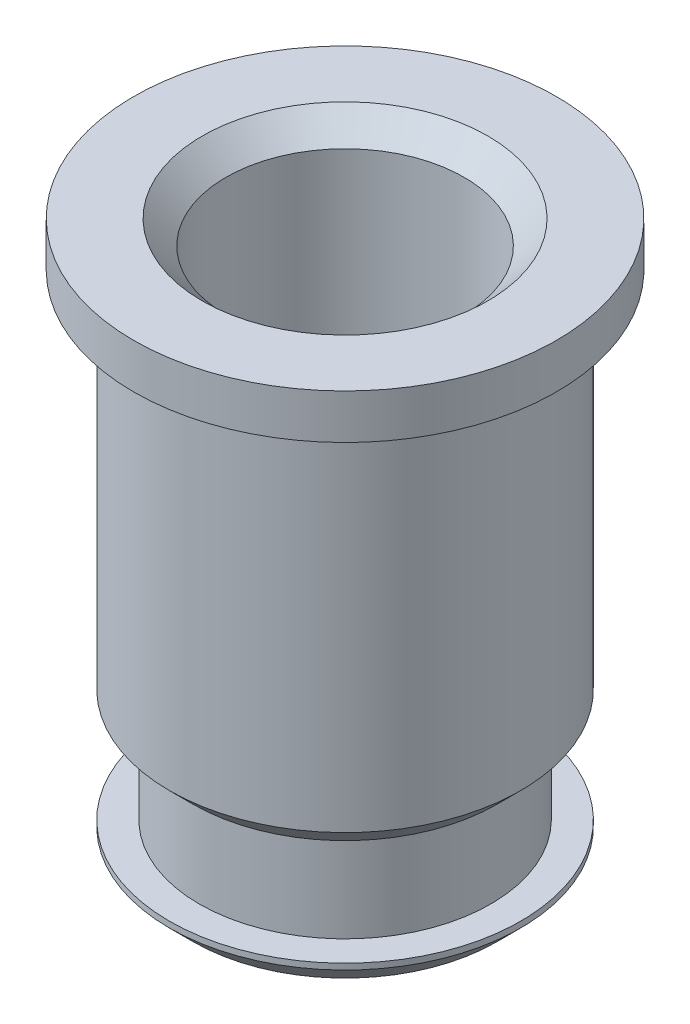
ISO-10303-21;
HEADER;
FILE_DESCRIPTION(('STEP AP214'),'2;1');
FILE_NAME('part.step','',(''),(''),'','','');
FILE_SCHEMA(('AUTOMOTIVE_DESIGN { 1 0 10303 214 1 1 1 1 }'));
ENDSEC;
DATA;
#1=APPLICATION_CONTEXT('core data for automotive mechanical design processes');
#2=APPLICATION_PROTOCOL_DEFINITION('international standard','automotive_design',2000,#1);
#3=PRODUCT_CONTEXT('',#1,'mechanical');
#4=PRODUCT('Part','Part','',(#3));
#5=PRODUCT_RELATED_PRODUCT_CATEGORY('part','',(#4));
#6=PRODUCT_DEFINITION_FORMATION('','',#4);
#7=PRODUCT_DEFINITION_CONTEXT('part definition',#1,'design');
#8=PRODUCT_DEFINITION('design','',#6,#7);
#9=PRODUCT_DEFINITION_SHAPE('','',#8);
#10=(LENGTH_UNIT() NAMED_UNIT(*) SI_UNIT(.MILLI.,.METRE.));
#11=(NAMED_UNIT(*) PLANE_ANGLE_UNIT() SI_UNIT($,.RADIAN.));
#12=(NAMED_UNIT(*) SI_UNIT($,.STERADIAN.) SOLID_ANGLE_UNIT());
#13=UNCERTAINTY_MEASURE_WITH_UNIT(LENGTH_MEASURE(1.E-05),#10,'distance_accuracy_value','');
#14=(GEOMETRIC_REPRESENTATION_CONTEXT(3) GLOBAL_UNCERTAINTY_ASSIGNED_CONTEXT((#13)) GLOBAL_UNIT_ASSIGNED_CONTEXT((#10,
#11,#12)) REPRESENTATION_CONTEXT('',''));
#15=CARTESIAN_POINT('',(0.,0.,0.));
#16=DIRECTION('',(0.,0.,1.));
#17=DIRECTION('',(1.,0.,0.));
#18=AXIS2_PLACEMENT_3D('',#15,#16,#17);
#19=CARTESIAN_POINT('',(0.,-8.5,0.));
#20=DIRECTION('',(0.,1.,0.));
#21=DIRECTION('',(0.,0.,1.));
#22=AXIS2_PLACEMENT_3D('',#19,#20,#21);
#23=CYLINDRICAL_SURFACE('',#22,2.95);
#24=CARTESIAN_POINT('',(0.,-8.1,0.));
#25=DIRECTION('',(0.,1.,0.));
#26=DIRECTION('',(0.,0.,1.));
#27=AXIS2_PLACEMENT_3D('',#24,#25,#26);
#28=CIRCLE('',#27,2.95);
#29=CARTESIAN_POINT('',(0.,-8.1,2.95));
#30=VERTEX_POINT('',#29);
#31=EDGE_CURVE('E39',#30,#30,#28,.T.);
#32=ORIENTED_EDGE('',*,*,#31,.T.);
#33=EDGE_LOOP('',(#32));
#34=FACE_BOUND('',#33,.T.);
#35=CARTESIAN_POINT('',(0.,-7.99999999999999,0.));
#36=DIRECTION('',(0.,1.,0.));
#37=DIRECTION('',(0.,0.,1.));
#38=AXIS2_PLACEMENT_3D('',#35,#36,#37);
#39=CIRCLE('',#38,2.95000000000003);
#40=CARTESIAN_POINT('',(0.,-8.,2.95));
#41=VERTEX_POINT('',#40);
#42=EDGE_CURVE('E68',#41,#41,#39,.T.);
#43=ORIENTED_EDGE('',*,*,#42,.F.);
#44=EDGE_LOOP('',(#43));
#45=FACE_BOUND('',#44,.T.);
#46=ADVANCED_FACE('F32',(#34,#45),#23,.T.);
#47=CARTESIAN_POINT('',(0.,-6.1,0.));
#48=DIRECTION('',(0.,1.,0.));
#49=DIRECTION('',(0.,0.,1.));
#50=AXIS2_PLACEMENT_3D('',#47,#48,#49);
#51=CIRCLE('',#50,2.95);
#52=CARTESIAN_POINT('',(0.,-6.1,2.95));
#53=VERTEX_POINT('',#52);
#54=EDGE_CURVE('E47',#53,#53,#51,.T.);
#55=ORIENTED_EDGE('',*,*,#54,.T.);
#56=EDGE_LOOP('',(#55));
#57=FACE_BOUND('',#56,.T.);
#58=CARTESIAN_POINT('',(0.,0.,0.));
#59=DIRECTION('',(0.,1.,0.));
#60=DIRECTION('',(0.,0.,1.));
#61=AXIS2_PLACEMENT_3D('',#58,#59,#60);
#62=CIRCLE('',#61,2.95);
#63=CARTESIAN_POINT('',(0.,0.,2.95));
#64=VERTEX_POINT('',#63);
#65=EDGE_CURVE('E58',#64,#64,#62,.T.);
#66=ORIENTED_EDGE('',*,*,#65,.F.);
#67=EDGE_LOOP('',(#66));
#68=FACE_BOUND('',#67,.T.);
#69=ADVANCED_FACE('F96',(#57,#68),#23,.T.);
#70=CARTESIAN_POINT('',(0.,-8.5,0.));
#71=DIRECTION('',(0.,1.,0.));
#72=DIRECTION('',(0.,0.,1.));
#73=AXIS2_PLACEMENT_3D('',#70,#71,#72);
#74=PLANE('',#73);
#75=CARTESIAN_POINT('',(0.,-8.5,0.));
#76=DIRECTION('',(0.,1.,0.));
#77=DIRECTION('',(0.,0.,1.));
#78=AXIS2_PLACEMENT_3D('',#75,#76,#77);
#79=CIRCLE('',#78,2.55);
#80=CARTESIAN_POINT('',(0.,-8.5,2.55));
#81=VERTEX_POINT('',#80);
#82=EDGE_CURVE('E10',#81,#81,#79,.F.);
#83=ORIENTED_EDGE('',*,*,#82,.T.);
#84=EDGE_LOOP('',(#83));
#85=FACE_BOUND('',#84,.T.);
#86=CARTESIAN_POINT('',(0.,-8.5,0.));
#87=DIRECTION('',(0.,1.,0.));
#88=DIRECTION('',(0.,0.,1.));
#89=AXIS2_PLACEMENT_3D('',#86,#87,#88);
#90=CIRCLE('',#89,2.);
#91=CARTESIAN_POINT('',(0.,-8.5,2.));
#92=VERTEX_POINT('',#91);
#93=EDGE_CURVE('E61',#92,#92,#90,.T.);
#94=ORIENTED_EDGE('',*,*,#93,.T.);
#95=EDGE_LOOP('',(#94));
#96=FACE_BOUND('',#95,.T.);
#97=ADVANCED_FACE('F101',(#85,#96),#74,.F.);
#98=CARTESIAN_POINT('',(0.,-8.5,0.));
#99=DIRECTION('',(0.,1.,0.));
#100=DIRECTION('',(0.,0.,1.));
#101=AXIS2_PLACEMENT_3D('',#98,#99,#100);
#102=CYLINDRICAL_SURFACE('',#101,2.);
#103=CARTESIAN_POINT('',(0.,0.349999999999998,0.));
#104=DIRECTION('',(0.,1.,0.));
#105=DIRECTION('',(0.,0.,1.));
#106=AXIS2_PLACEMENT_3D('',#103,#104,#105);
#107=CIRCLE('',#106,2.);
#108=CARTESIAN_POINT('',(0.,0.349999999999998,2.));
#109=VERTEX_POINT('',#108);
#110=EDGE_CURVE('E55',#109,#109,#107,.T.);
#111=ORIENTED_EDGE('',*,*,#110,.T.);
#112=EDGE_LOOP('',(#111));
#113=FACE_BOUND('',#112,.T.);
#114=ORIENTED_EDGE('',*,*,#93,.F.);
#115=EDGE_LOOP('',(#114));
#116=FACE_BOUND('',#115,.T.);
#117=ADVANCED_FACE('F136',(#113,#116),#102,.F.);
#118=CARTESIAN_POINT('',(0.,0.75,0.));
#119=DIRECTION('',(0.,1.,0.));
#120=DIRECTION('',(0.,0.,1.));
#121=AXIS2_PLACEMENT_3D('',#118,#119,#120);
#122=PLANE('',#121);
#123=CARTESIAN_POINT('',(0.,0.75,0.));
#124=DIRECTION('',(0.,1.,0.));
#125=DIRECTION('',(0.,0.,1.));
#126=AXIS2_PLACEMENT_3D('',#123,#124,#125);
#127=CIRCLE('',#126,2.4);
#128=CARTESIAN_POINT('',(0.,0.75,2.4));
#129=VERTEX_POINT('',#128);
#130=EDGE_CURVE('E52',#129,#129,#127,.F.);
#131=ORIENTED_EDGE('',*,*,#130,.T.);
#132=EDGE_LOOP('',(#131));
#133=FACE_BOUND('',#132,.T.);
#134=CARTESIAN_POINT('',(0.,0.75,0.));
#135=DIRECTION('',(0.,1.,0.));
#136=DIRECTION('',(0.,0.,1.));
#137=AXIS2_PLACEMENT_3D('',#134,#135,#136);
#138=CIRCLE('',#137,3.55);
#139=CARTESIAN_POINT('',(0.,0.75,3.55));
#140=VERTEX_POINT('',#139);
#141=EDGE_CURVE('E64',#140,#140,#138,.T.);
#142=ORIENTED_EDGE('',*,*,#141,.T.);
#143=EDGE_LOOP('',(#142));
#144=FACE_BOUND('',#143,.T.);
#145=ADVANCED_FACE('F125',(#133,#144),#122,.T.);
#146=CARTESIAN_POINT('',(0.,0.,0.));
#147=DIRECTION('',(0.,1.,0.));
#148=DIRECTION('',(0.,0.,1.));
#149=AXIS2_PLACEMENT_3D('',#146,#147,#148);
#150=PLANE('',#149);
#151=ORIENTED_EDGE('',*,*,#65,.T.);
#152=EDGE_LOOP('',(#151));
#153=FACE_BOUND('',#152,.T.);
#154=CARTESIAN_POINT('',(0.,0.,0.));
#155=DIRECTION('',(0.,1.,0.));
#156=DIRECTION('',(0.,0.,1.));
#157=AXIS2_PLACEMENT_3D('',#154,#155,#156);
#158=CIRCLE('',#157,3.55);
#159=CARTESIAN_POINT('',(0.,0.,3.55));
#160=VERTEX_POINT('',#159);
#161=EDGE_CURVE('E65',#160,#160,#158,.T.);
#162=ORIENTED_EDGE('',*,*,#161,.F.);
#163=EDGE_LOOP('',(#162));
#164=FACE_BOUND('',#163,.T.);
#165=ADVANCED_FACE('F122',(#153,#164),#150,.F.);
#166=CARTESIAN_POINT('',(0.,0.75,0.));
#167=DIRECTION('',(0.,-1.,0.));
#168=DIRECTION('',(0.,0.,-1.));
#169=AXIS2_PLACEMENT_3D('',#166,#167,#168);
#170=CYLINDRICAL_SURFACE('',#169,3.55);
#171=ORIENTED_EDGE('',*,*,#141,.F.);
#172=EDGE_LOOP('',(#171));
#173=FACE_BOUND('',#172,.T.);
#174=ORIENTED_EDGE('',*,*,#161,.T.);
#175=EDGE_LOOP('',(#174));
#176=FACE_BOUND('',#175,.T.);
#177=ADVANCED_FACE('F91',(#173,#176),#170,.T.);
#178=CARTESIAN_POINT('',(0.,-8.,2.95));
#179=DIRECTION('',(0.,-1.,0.));
#180=DIRECTION('',(0.,0.,-1.));
#181=AXIS2_PLACEMENT_3D('',#178,#179,#180);
#182=PLANE('',#181);
#183=CARTESIAN_POINT('',(0.,-7.99999999999999,0.));
#184=DIRECTION('',(0.,1.,0.));
#185=DIRECTION('',(0.,0.,1.));
#186=AXIS2_PLACEMENT_3D('',#183,#184,#185);
#187=CIRCLE('',#186,2.45000000000003);
#188=CARTESIAN_POINT('',(0.,-8.,2.45));
#189=VERTEX_POINT('',#188);
#190=EDGE_CURVE('E73',#189,#189,#187,.T.);
#191=ORIENTED_EDGE('',*,*,#190,.F.);
#192=EDGE_LOOP('',(#191));
#193=FACE_BOUND('',#192,.T.);
#194=ORIENTED_EDGE('',*,*,#42,.T.);
#195=EDGE_LOOP('',(#194));
#196=FACE_BOUND('',#195,.T.);
#197=ADVANCED_FACE('F85',(#193,#196),#182,.F.);
#198=CARTESIAN_POINT('',(0.,0.,0.));
#199=DIRECTION('',(0.,1.,0.));
#200=DIRECTION('',(0.,0.,1.));
#201=AXIS2_PLACEMENT_3D('',#198,#199,#200);
#202=CYLINDRICAL_SURFACE('',#201,2.45000000000003);
#203=CARTESIAN_POINT('',(0.,-6.49999999999999,0.));
#204=DIRECTION('',(0.,1.,0.));
#205=DIRECTION('',(0.,0.,1.));
#206=AXIS2_PLACEMENT_3D('',#203,#204,#205);
#207=CIRCLE('',#206,2.45000000000002);
#208=CARTESIAN_POINT('',(0.,-6.5,2.45));
#209=VERTEX_POINT('',#208);
#210=EDGE_CURVE('E76',#209,#209,#207,.T.);
#211=ORIENTED_EDGE('',*,*,#210,.F.);
#212=EDGE_LOOP('',(#211));
#213=FACE_BOUND('',#212,.T.);
#214=ORIENTED_EDGE('',*,*,#190,.T.);
#215=EDGE_LOOP('',(#214));
#216=FACE_BOUND('',#215,.T.);
#217=ADVANCED_FACE('F82',(#213,#216),#202,.T.);
#218=CARTESIAN_POINT('',(0.,-6.5,2.95));
#219=DIRECTION('',(0.,1.,0.));
#220=DIRECTION('',(0.,0.,1.));
#221=AXIS2_PLACEMENT_3D('',#218,#219,#220);
#222=PLANE('',#221);
#223=CARTESIAN_POINT('',(0.,-6.49999999999999,0.));
#224=DIRECTION('',(0.,1.,0.));
#225=DIRECTION('',(0.,0.,1.));
#226=AXIS2_PLACEMENT_3D('',#223,#224,#225);
#227=CIRCLE('',#226,2.54999999999999);
#228=CARTESIAN_POINT('',(0.,-6.5,2.54999999999999));
#229=VERTEX_POINT('',#228);
#230=EDGE_CURVE('E43',#229,#229,#227,.F.);
#231=ORIENTED_EDGE('',*,*,#230,.T.);
#232=EDGE_LOOP('',(#231));
#233=FACE_BOUND('',#232,.T.);
#234=ORIENTED_EDGE('',*,*,#210,.T.);
#235=EDGE_LOOP('',(#234));
#236=FACE_BOUND('',#235,.T.);
#237=ADVANCED_FACE('F80',(#233,#236),#222,.F.);
#238=CARTESIAN_POINT('',(0.,0.349999999999998,0.));
#239=DIRECTION('',(0.,1.,0.));
#240=DIRECTION('',(0.,0.,1.));
#241=AXIS2_PLACEMENT_3D('',#238,#239,#240);
#242=CONICAL_SURFACE('',#241,2.,0.78539816339745);
#243=ORIENTED_EDGE('',*,*,#130,.F.);
#244=EDGE_LOOP('',(#243));
#245=FACE_BOUND('',#244,.T.);
#246=ORIENTED_EDGE('',*,*,#110,.F.);
#247=EDGE_LOOP('',(#246));
#248=FACE_BOUND('',#247,.T.);
#249=ADVANCED_FACE('F106',(#245,#248),#242,.F.);
#250=CARTESIAN_POINT('',(0.,-6.1,0.));
#251=DIRECTION('',(0.,1.,0.));
#252=DIRECTION('',(0.,0.,1.));
#253=AXIS2_PLACEMENT_3D('',#250,#251,#252);
#254=CONICAL_SURFACE('',#253,2.95,0.785398163397452);
#255=ORIENTED_EDGE('',*,*,#230,.F.);
#256=EDGE_LOOP('',(#255));
#257=FACE_BOUND('',#256,.T.);
#258=ORIENTED_EDGE('',*,*,#54,.F.);
#259=EDGE_LOOP('',(#258));
#260=FACE_BOUND('',#259,.T.);
#261=ADVANCED_FACE('F108',(#257,#260),#254,.T.);
#262=CARTESIAN_POINT('',(0.,-8.1,0.));
#263=DIRECTION('',(0.,1.,0.));
#264=DIRECTION('',(0.,0.,1.));
#265=AXIS2_PLACEMENT_3D('',#262,#263,#264);
#266=CONICAL_SURFACE('',#265,2.95,0.785398163397448);
#267=ORIENTED_EDGE('',*,*,#82,.F.);
#268=EDGE_LOOP('',(#267));
#269=FACE_BOUND('',#268,.T.);
#270=ORIENTED_EDGE('',*,*,#31,.F.);
#271=EDGE_LOOP('',(#270));
#272=FACE_BOUND('',#271,.T.);
#273=ADVANCED_FACE('F34',(#269,#272),#266,.T.);
#274=CLOSED_SHELL('',(#46,#69,#97,#117,#145,#165,#177,#197,#217,#237,#249,#261,#273));
#275=MANIFOLD_SOLID_BREP('B2',#274);
#276=ADVANCED_BREP_SHAPE_REPRESENTATION('',(#18,#275),#14);
#277=SHAPE_DEFINITION_REPRESENTATION(#9,#276);
ENDSEC;
END-ISO-10303-21;
